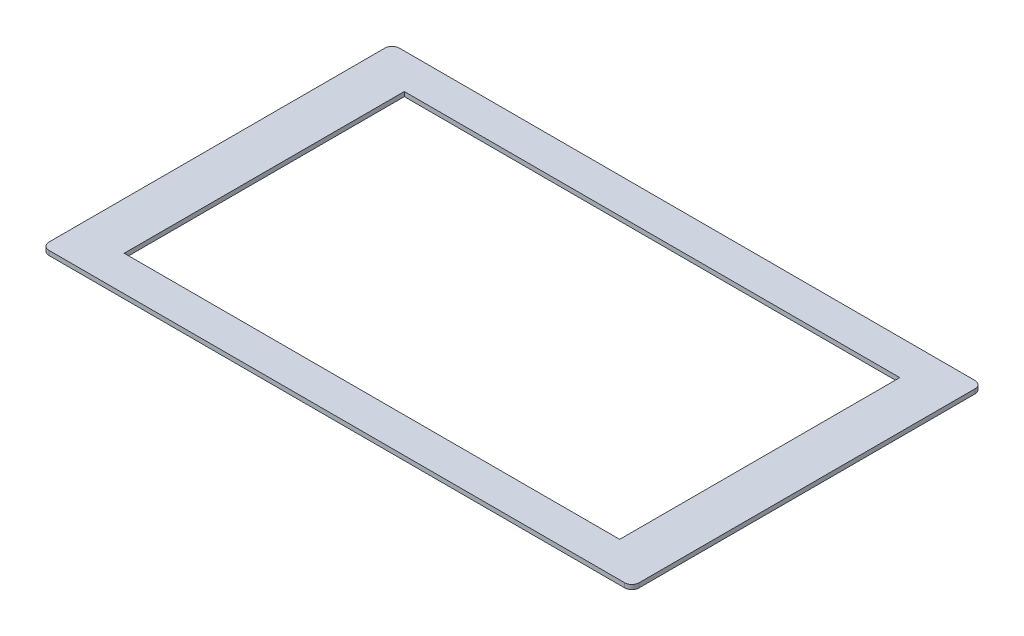
ISO-10303-21;
HEADER;
FILE_DESCRIPTION(('STEP AP214'),'2;1');
FILE_NAME('part.step','',(''),(''),'','','');
FILE_SCHEMA(('AUTOMOTIVE_DESIGN { 1 0 10303 214 1 1 1 1 }'));
ENDSEC;
DATA;
#1=APPLICATION_CONTEXT('core data for automotive mechanical design processes');
#2=APPLICATION_PROTOCOL_DEFINITION('international standard','automotive_design',2000,#1);
#3=PRODUCT_CONTEXT('',#1,'mechanical');
#4=PRODUCT('Part','Part','',(#3));
#5=PRODUCT_RELATED_PRODUCT_CATEGORY('part','',(#4));
#6=PRODUCT_DEFINITION_FORMATION('','',#4);
#7=PRODUCT_DEFINITION_CONTEXT('part definition',#1,'design');
#8=PRODUCT_DEFINITION('design','',#6,#7);
#9=PRODUCT_DEFINITION_SHAPE('','',#8);
#10=(LENGTH_UNIT() NAMED_UNIT(*) SI_UNIT(.MILLI.,.METRE.));
#11=(NAMED_UNIT(*) PLANE_ANGLE_UNIT() SI_UNIT($,.RADIAN.));
#12=(NAMED_UNIT(*) SI_UNIT($,.STERADIAN.) SOLID_ANGLE_UNIT());
#13=UNCERTAINTY_MEASURE_WITH_UNIT(LENGTH_MEASURE(1.E-05),#10,'distance_accuracy_value','');
#14=(GEOMETRIC_REPRESENTATION_CONTEXT(3) GLOBAL_UNCERTAINTY_ASSIGNED_CONTEXT((#13)) GLOBAL_UNIT_ASSIGNED_CONTEXT((#10,
#11,#12)) REPRESENTATION_CONTEXT('',''));
#15=CARTESIAN_POINT('',(0.,0.,0.));
#16=DIRECTION('',(0.,0.,1.));
#17=DIRECTION('',(1.,0.,0.));
#18=AXIS2_PLACEMENT_3D('',#15,#16,#17);
#19=CARTESIAN_POINT('',(-70.7372,0.000128867099995489,-43.045));
#20=DIRECTION('',(0.,0.,-1.));
#21=DIRECTION('',(0.,-1.,0.));
#22=AXIS2_PLACEMENT_3D('',#19,#20,#21);
#23=PLANE('',#22);
#24=DIRECTION('',(1.,0.,0.));
#25=VECTOR('',#24,1.);
#26=CARTESIAN_POINT('',(-70.7372,0.000128867099995489,-43.045));
#27=LINE('',#26,#25);
#28=CARTESIAN_POINT('',(-70.7372,0.000128867099995489,-43.045));
#29=VERTEX_POINT('',#28);
#30=CARTESIAN_POINT('',(70.737,0.000128867099995489,-43.045));
#31=VERTEX_POINT('',#30);
#32=EDGE_CURVE('E122',#29,#31,#27,.T.);
#33=ORIENTED_EDGE('',*,*,#32,.T.);
#34=DIRECTION('',(0.,-1.,0.));
#35=VECTOR('',#34,1.);
#36=CARTESIAN_POINT('',(70.737,0.000128867099995489,-43.045));
#37=LINE('',#36,#35);
#38=CARTESIAN_POINT('',(70.737,-1.0998711329,-43.045));
#39=VERTEX_POINT('',#38);
#40=EDGE_CURVE('E159',#31,#39,#37,.T.);
#41=ORIENTED_EDGE('',*,*,#40,.T.);
#42=DIRECTION('',(1.,0.,0.));
#43=VECTOR('',#42,1.);
#44=CARTESIAN_POINT('',(-70.7372,-1.0998711329,-43.045));
#45=LINE('',#44,#43);
#46=CARTESIAN_POINT('',(-70.7372,-1.0998711329,-43.045));
#47=VERTEX_POINT('',#46);
#48=EDGE_CURVE('E125',#47,#39,#45,.T.);
#49=ORIENTED_EDGE('',*,*,#48,.F.);
#50=DIRECTION('',(0.,-1.,0.));
#51=VECTOR('',#50,1.);
#52=CARTESIAN_POINT('',(-70.7372,0.000128867099995489,-43.045));
#53=LINE('',#52,#51);
#54=EDGE_CURVE('E11',#29,#47,#53,.T.);
#55=ORIENTED_EDGE('',*,*,#54,.F.);
#56=EDGE_LOOP('',(#33,#41,#49,#55));
#57=FACE_BOUND('',#56,.T.);
#58=ADVANCED_FACE('F16',(#57),#23,.T.);
#59=CARTESIAN_POINT('',(-70.7369999886866,0.000128867099995489,-41.277));
#60=DIRECTION('',(0.,-1.,0.));
#61=DIRECTION('',(-1.,0.,0.));
#62=AXIS2_PLACEMENT_3D('',#59,#60,#61);
#63=CYLINDRICAL_SURFACE('',#62,1.76800001131349);
#64=CARTESIAN_POINT('',(-70.7369999886866,0.000128867099995489,-41.277));
#65=DIRECTION('',(0.,-1.,0.));
#66=DIRECTION('',(-1.,0.,0.));
#67=AXIS2_PLACEMENT_3D('',#64,#65,#66);
#68=CIRCLE('',#67,1.76800001131349);
#69=CARTESIAN_POINT('',(-72.505,0.000128867099995489,-41.277));
#70=VERTEX_POINT('',#69);
#71=EDGE_CURVE('E128',#70,#29,#68,.T.);
#72=ORIENTED_EDGE('',*,*,#71,.T.);
#73=ORIENTED_EDGE('',*,*,#54,.T.);
#74=CARTESIAN_POINT('',(-70.7369999886866,-1.0998711329,-41.277));
#75=DIRECTION('',(0.,-1.,0.));
#76=DIRECTION('',(-1.,0.,0.));
#77=AXIS2_PLACEMENT_3D('',#74,#75,#76);
#78=CIRCLE('',#77,1.76800001131349);
#79=CARTESIAN_POINT('',(-72.505,-1.0998711329,-41.277));
#80=VERTEX_POINT('',#79);
#81=EDGE_CURVE('E157',#80,#47,#78,.T.);
#82=ORIENTED_EDGE('',*,*,#81,.F.);
#83=DIRECTION('',(0.,-1.,0.));
#84=VECTOR('',#83,1.);
#85=CARTESIAN_POINT('',(-72.505,0.000128867099995489,-41.277));
#86=LINE('',#85,#84);
#87=EDGE_CURVE('E27',#70,#80,#86,.T.);
#88=ORIENTED_EDGE('',*,*,#87,.F.);
#89=EDGE_LOOP('',(#72,#73,#82,#88));
#90=FACE_BOUND('',#89,.T.);
#91=ADVANCED_FACE('F129',(#90),#63,.T.);
#92=CARTESIAN_POINT('',(-72.505,0.000128867100004371,41.277));
#93=DIRECTION('',(-1.,0.,0.));
#94=DIRECTION('',(0.,0.,1.));
#95=AXIS2_PLACEMENT_3D('',#92,#93,#94);
#96=PLANE('',#95);
#97=DIRECTION('',(0.,0.,1.));
#98=VECTOR('',#97,1.);
#99=CARTESIAN_POINT('',(-72.505,0.000128867099995489,-41.277));
#100=LINE('',#99,#98);
#101=CARTESIAN_POINT('',(-72.505,0.000128867100004371,41.277));
#102=VERTEX_POINT('',#101);
#103=EDGE_CURVE('E133',#70,#102,#100,.T.);
#104=ORIENTED_EDGE('',*,*,#103,.F.);
#105=ORIENTED_EDGE('',*,*,#87,.T.);
#106=DIRECTION('',(0.,0.,-1.));
#107=VECTOR('',#106,1.);
#108=CARTESIAN_POINT('',(-72.505,-1.0998711329,-41.277));
#109=LINE('',#108,#107);
#110=CARTESIAN_POINT('',(-72.505,-1.09987113289999,41.277));
#111=VERTEX_POINT('',#110);
#112=EDGE_CURVE('E153',#111,#80,#109,.T.);
#113=ORIENTED_EDGE('',*,*,#112,.F.);
#114=DIRECTION('',(0.,-1.,0.));
#115=VECTOR('',#114,1.);
#116=CARTESIAN_POINT('',(-72.505,0.000128867100004371,41.277));
#117=LINE('',#116,#115);
#118=EDGE_CURVE('E166',#102,#111,#117,.T.);
#119=ORIENTED_EDGE('',*,*,#118,.F.);
#120=EDGE_LOOP('',(#104,#105,#113,#119));
#121=FACE_BOUND('',#120,.T.);
#122=ADVANCED_FACE('F272',(#121),#96,.T.);
#123=CARTESIAN_POINT('',(-70.737,0.000128867100004371,41.277));
#124=DIRECTION('',(0.,-1.,0.));
#125=DIRECTION('',(0.,0.,1.));
#126=AXIS2_PLACEMENT_3D('',#123,#124,#125);
#127=CYLINDRICAL_SURFACE('',#126,1.768);
#128=CARTESIAN_POINT('',(-70.737,0.000128867100004371,41.277));
#129=DIRECTION('',(0.,-1.,0.));
#130=DIRECTION('',(0.,0.,1.));
#131=AXIS2_PLACEMENT_3D('',#128,#129,#130);
#132=CIRCLE('',#131,1.768);
#133=CARTESIAN_POINT('',(-70.737,0.000128867100004371,43.045));
#134=VERTEX_POINT('',#133);
#135=EDGE_CURVE('E237',#134,#102,#132,.T.);
#136=ORIENTED_EDGE('',*,*,#135,.T.);
#137=ORIENTED_EDGE('',*,*,#118,.T.);
#138=CARTESIAN_POINT('',(-70.737,-1.09987113289999,41.277));
#139=DIRECTION('',(0.,-1.,0.));
#140=DIRECTION('',(0.,0.,1.));
#141=AXIS2_PLACEMENT_3D('',#138,#139,#140);
#142=CIRCLE('',#141,1.768);
#143=CARTESIAN_POINT('',(-70.737,-1.09987113289999,43.045));
#144=VERTEX_POINT('',#143);
#145=EDGE_CURVE('E158',#144,#111,#142,.T.);
#146=ORIENTED_EDGE('',*,*,#145,.F.);
#147=DIRECTION('',(0.,-1.,0.));
#148=VECTOR('',#147,1.);
#149=CARTESIAN_POINT('',(-70.737,0.000128867100004371,43.045));
#150=LINE('',#149,#148);
#151=EDGE_CURVE('E232',#134,#144,#150,.T.);
#152=ORIENTED_EDGE('',*,*,#151,.F.);
#153=EDGE_LOOP('',(#136,#137,#146,#152));
#154=FACE_BOUND('',#153,.T.);
#155=ADVANCED_FACE('F279',(#154),#127,.T.);
#156=CARTESIAN_POINT('',(70.737,0.000128867100004371,43.045));
#157=DIRECTION('',(0.,0.,1.));
#158=DIRECTION('',(1.,0.,0.));
#159=AXIS2_PLACEMENT_3D('',#156,#157,#158);
#160=PLANE('',#159);
#161=DIRECTION('',(1.,0.,0.));
#162=VECTOR('',#161,1.);
#163=CARTESIAN_POINT('',(-72.505,0.000128867100004371,43.045));
#164=LINE('',#163,#162);
#165=CARTESIAN_POINT('',(70.737,0.000128867100004371,43.045));
#166=VERTEX_POINT('',#165);
#167=EDGE_CURVE('E203',#134,#166,#164,.T.);
#168=ORIENTED_EDGE('',*,*,#167,.F.);
#169=ORIENTED_EDGE('',*,*,#151,.T.);
#170=DIRECTION('',(-1.,0.,0.));
#171=VECTOR('',#170,1.);
#172=CARTESIAN_POINT('',(-72.505,-1.09987113289999,43.045));
#173=LINE('',#172,#171);
#174=CARTESIAN_POINT('',(70.737,-1.09987113289999,43.045));
#175=VERTEX_POINT('',#174);
#176=EDGE_CURVE('E170',#175,#144,#173,.T.);
#177=ORIENTED_EDGE('',*,*,#176,.F.);
#178=DIRECTION('',(0.,-1.,0.));
#179=VECTOR('',#178,1.);
#180=CARTESIAN_POINT('',(70.737,0.000128867100004371,43.045));
#181=LINE('',#180,#179);
#182=EDGE_CURVE('E229',#166,#175,#181,.T.);
#183=ORIENTED_EDGE('',*,*,#182,.F.);
#184=EDGE_LOOP('',(#168,#169,#177,#183));
#185=FACE_BOUND('',#184,.T.);
#186=ADVANCED_FACE('F282',(#185),#160,.T.);
#187=CARTESIAN_POINT('',(70.737,0.000128867100004371,41.277));
#188=DIRECTION('',(0.,-1.,0.));
#189=DIRECTION('',(1.,0.,0.));
#190=AXIS2_PLACEMENT_3D('',#187,#188,#189);
#191=CYLINDRICAL_SURFACE('',#190,1.768);
#192=CARTESIAN_POINT('',(70.737,0.000128867100004371,41.277));
#193=DIRECTION('',(0.,-1.,0.));
#194=DIRECTION('',(1.,0.,0.));
#195=AXIS2_PLACEMENT_3D('',#192,#193,#194);
#196=CIRCLE('',#195,1.768);
#197=CARTESIAN_POINT('',(72.505,0.000128867100004371,41.277));
#198=VERTEX_POINT('',#197);
#199=EDGE_CURVE('E194',#198,#166,#196,.T.);
#200=ORIENTED_EDGE('',*,*,#199,.T.);
#201=ORIENTED_EDGE('',*,*,#182,.T.);
#202=CARTESIAN_POINT('',(70.737,-1.09987113289999,41.277));
#203=DIRECTION('',(0.,-1.,0.));
#204=DIRECTION('',(1.,0.,0.));
#205=AXIS2_PLACEMENT_3D('',#202,#203,#204);
#206=CIRCLE('',#205,1.768);
#207=CARTESIAN_POINT('',(72.505,-1.09987113289999,41.277));
#208=VERTEX_POINT('',#207);
#209=EDGE_CURVE('E171',#208,#175,#206,.T.);
#210=ORIENTED_EDGE('',*,*,#209,.F.);
#211=DIRECTION('',(0.,-1.,0.));
#212=VECTOR('',#211,1.);
#213=CARTESIAN_POINT('',(72.505,0.000128867100004371,41.277));
#214=LINE('',#213,#212);
#215=EDGE_CURVE('E162',#198,#208,#214,.T.);
#216=ORIENTED_EDGE('',*,*,#215,.F.);
#217=EDGE_LOOP('',(#200,#201,#210,#216));
#218=FACE_BOUND('',#217,.T.);
#219=ADVANCED_FACE('F18',(#218),#191,.T.);
#220=CARTESIAN_POINT('',(72.505,0.000128867099995489,-41.277));
#221=DIRECTION('',(1.,0.,0.));
#222=DIRECTION('',(0.,0.,1.));
#223=AXIS2_PLACEMENT_3D('',#220,#221,#222);
#224=PLANE('',#223);
#225=DIRECTION('',(0.,0.,1.));
#226=VECTOR('',#225,1.);
#227=CARTESIAN_POINT('',(72.505,0.000128867099995489,-43.045));
#228=LINE('',#227,#226);
#229=CARTESIAN_POINT('',(72.505,0.000128867099995489,-41.277));
#230=VERTEX_POINT('',#229);
#231=EDGE_CURVE('E184',#230,#198,#228,.T.);
#232=ORIENTED_EDGE('',*,*,#231,.T.);
#233=ORIENTED_EDGE('',*,*,#215,.T.);
#234=DIRECTION('',(0.,0.,1.));
#235=VECTOR('',#234,1.);
#236=CARTESIAN_POINT('',(72.505,-1.0998711329,-43.045));
#237=LINE('',#236,#235);
#238=CARTESIAN_POINT('',(72.505,-1.0998711329,-41.277));
#239=VERTEX_POINT('',#238);
#240=EDGE_CURVE('E175',#239,#208,#237,.T.);
#241=ORIENTED_EDGE('',*,*,#240,.F.);
#242=DIRECTION('',(0.,-1.,0.));
#243=VECTOR('',#242,1.);
#244=CARTESIAN_POINT('',(72.505,0.000128867099995489,-41.277));
#245=LINE('',#244,#243);
#246=EDGE_CURVE('E163',#230,#239,#245,.T.);
#247=ORIENTED_EDGE('',*,*,#246,.F.);
#248=EDGE_LOOP('',(#232,#233,#241,#247));
#249=FACE_BOUND('',#248,.T.);
#250=ADVANCED_FACE('F247',(#249),#224,.T.);
#251=CARTESIAN_POINT('',(70.737,0.000128867099995489,-41.277));
#252=DIRECTION('',(0.,-1.,0.));
#253=DIRECTION('',(0.,0.,-1.));
#254=AXIS2_PLACEMENT_3D('',#251,#252,#253);
#255=CYLINDRICAL_SURFACE('',#254,1.768);
#256=CARTESIAN_POINT('',(70.737,0.000128867099995489,-41.277));
#257=DIRECTION('',(0.,-1.,0.));
#258=DIRECTION('',(0.,0.,-1.));
#259=AXIS2_PLACEMENT_3D('',#256,#257,#258);
#260=CIRCLE('',#259,1.768);
#261=EDGE_CURVE('E138',#31,#230,#260,.T.);
#262=ORIENTED_EDGE('',*,*,#261,.T.);
#263=ORIENTED_EDGE('',*,*,#246,.T.);
#264=CARTESIAN_POINT('',(70.737,-1.0998711329,-41.277));
#265=DIRECTION('',(0.,-1.,0.));
#266=DIRECTION('',(0.,0.,-1.));
#267=AXIS2_PLACEMENT_3D('',#264,#265,#266);
#268=CIRCLE('',#267,1.768);
#269=EDGE_CURVE('E181',#39,#239,#268,.T.);
#270=ORIENTED_EDGE('',*,*,#269,.F.);
#271=ORIENTED_EDGE('',*,*,#40,.F.);
#272=EDGE_LOOP('',(#262,#263,#270,#271));
#273=FACE_BOUND('',#272,.T.);
#274=ADVANCED_FACE('F254',(#273),#255,.T.);
#275=CARTESIAN_POINT('',(0.,-1.0998711329,0.));
#276=DIRECTION('',(0.,-1.,0.));
#277=DIRECTION('',(-1.,0.,0.));
#278=AXIS2_PLACEMENT_3D('',#275,#276,#277);
#279=PLANE('',#278);
#280=DIRECTION('',(0.,0.,1.));
#281=VECTOR('',#280,1.);
#282=CARTESIAN_POINT('',(-60.88,-1.0998711329,17.21));
#283=LINE('',#282,#281);
#284=CARTESIAN_POINT('',(-60.88,-1.0998711329,-34.42));
#285=VERTEX_POINT('',#284);
#286=CARTESIAN_POINT('',(-60.88,-1.09987113289999,34.42));
#287=VERTEX_POINT('',#286);
#288=EDGE_CURVE('E20',#285,#287,#283,.T.);
#289=ORIENTED_EDGE('',*,*,#288,.T.);
#290=DIRECTION('',(1.,0.,0.));
#291=VECTOR('',#290,1.);
#292=CARTESIAN_POINT('',(30.44,-1.09987113289999,34.42));
#293=LINE('',#292,#291);
#294=CARTESIAN_POINT('',(60.88,-1.09987113289999,34.42));
#295=VERTEX_POINT('',#294);
#296=EDGE_CURVE('E217',#287,#295,#293,.T.);
#297=ORIENTED_EDGE('',*,*,#296,.T.);
#298=DIRECTION('',(0.,0.,-1.));
#299=VECTOR('',#298,1.);
#300=CARTESIAN_POINT('',(60.88,-1.0998711329,-17.21));
#301=LINE('',#300,#299);
#302=CARTESIAN_POINT('',(60.88,-1.0998711329,-34.42));
#303=VERTEX_POINT('',#302);
#304=EDGE_CURVE('E179',#295,#303,#301,.T.);
#305=ORIENTED_EDGE('',*,*,#304,.T.);
#306=DIRECTION('',(-1.,0.,0.));
#307=VECTOR('',#306,1.);
#308=CARTESIAN_POINT('',(-30.44,-1.0998711329,-34.42));
#309=LINE('',#308,#307);
#310=EDGE_CURVE('E151',#303,#285,#309,.T.);
#311=ORIENTED_EDGE('',*,*,#310,.T.);
#312=EDGE_LOOP('',(#289,#297,#305,#311));
#313=FACE_BOUND('',#312,.T.);
#314=ORIENTED_EDGE('',*,*,#269,.T.);
#315=ORIENTED_EDGE('',*,*,#240,.T.);
#316=ORIENTED_EDGE('',*,*,#209,.T.);
#317=ORIENTED_EDGE('',*,*,#176,.T.);
#318=ORIENTED_EDGE('',*,*,#145,.T.);
#319=ORIENTED_EDGE('',*,*,#112,.T.);
#320=ORIENTED_EDGE('',*,*,#81,.T.);
#321=ORIENTED_EDGE('',*,*,#48,.T.);
#322=EDGE_LOOP('',(#314,#315,#316,#317,#318,#319,#320,#321));
#323=FACE_BOUND('',#322,.T.);
#324=ADVANCED_FACE('F252',(#313,#323),#279,.T.);
#325=CARTESIAN_POINT('',(0.,0.00012886709999993,0.));
#326=DIRECTION('',(0.,-1.,0.));
#327=DIRECTION('',(-1.,0.,0.));
#328=AXIS2_PLACEMENT_3D('',#325,#326,#327);
#329=PLANE('',#328);
#330=DIRECTION('',(0.,0.,-1.));
#331=VECTOR('',#330,1.);
#332=CARTESIAN_POINT('',(-60.88,0.000128867100004371,17.21));
#333=LINE('',#332,#331);
#334=CARTESIAN_POINT('',(-60.88,0.000128867100004371,34.42));
#335=VERTEX_POINT('',#334);
#336=CARTESIAN_POINT('',(-60.88,0.000128867099995489,-34.42));
#337=VERTEX_POINT('',#336);
#338=EDGE_CURVE('E206',#335,#337,#333,.T.);
#339=ORIENTED_EDGE('',*,*,#338,.T.);
#340=DIRECTION('',(1.,0.,0.));
#341=VECTOR('',#340,1.);
#342=CARTESIAN_POINT('',(-30.44,0.000128867099995489,-34.42));
#343=LINE('',#342,#341);
#344=CARTESIAN_POINT('',(60.88,0.000128867099995489,-34.42));
#345=VERTEX_POINT('',#344);
#346=EDGE_CURVE('E144',#337,#345,#343,.T.);
#347=ORIENTED_EDGE('',*,*,#346,.T.);
#348=DIRECTION('',(0.,0.,1.));
#349=VECTOR('',#348,1.);
#350=CARTESIAN_POINT('',(60.88,0.00012886709999993,-17.21));
#351=LINE('',#350,#349);
#352=CARTESIAN_POINT('',(60.88,0.000128867100004371,34.42));
#353=VERTEX_POINT('',#352);
#354=EDGE_CURVE('E152',#345,#353,#351,.T.);
#355=ORIENTED_EDGE('',*,*,#354,.T.);
#356=DIRECTION('',(-1.,0.,0.));
#357=VECTOR('',#356,1.);
#358=CARTESIAN_POINT('',(30.44,0.000128867100004371,34.42));
#359=LINE('',#358,#357);
#360=EDGE_CURVE('E180',#353,#335,#359,.T.);
#361=ORIENTED_EDGE('',*,*,#360,.T.);
#362=EDGE_LOOP('',(#339,#347,#355,#361));
#363=FACE_BOUND('',#362,.T.);
#364=ORIENTED_EDGE('',*,*,#261,.F.);
#365=ORIENTED_EDGE('',*,*,#32,.F.);
#366=ORIENTED_EDGE('',*,*,#71,.F.);
#367=ORIENTED_EDGE('',*,*,#103,.T.);
#368=ORIENTED_EDGE('',*,*,#135,.F.);
#369=ORIENTED_EDGE('',*,*,#167,.T.);
#370=ORIENTED_EDGE('',*,*,#199,.F.);
#371=ORIENTED_EDGE('',*,*,#231,.F.);
#372=EDGE_LOOP('',(#364,#365,#366,#367,#368,#369,#370,#371));
#373=FACE_BOUND('',#372,.T.);
#374=ADVANCED_FACE('F135',(#363,#373),#329,.F.);
#375=CARTESIAN_POINT('',(-60.88,0.000128867099995489,-34.42));
#376=DIRECTION('',(0.,0.,-1.));
#377=DIRECTION('',(0.,-1.,0.));
#378=AXIS2_PLACEMENT_3D('',#375,#376,#377);
#379=PLANE('',#378);
#380=ORIENTED_EDGE('',*,*,#310,.F.);
#381=DIRECTION('',(0.,-1.,0.));
#382=VECTOR('',#381,1.);
#383=CARTESIAN_POINT('',(60.88,0.000128867099995489,-34.42));
#384=LINE('',#383,#382);
#385=EDGE_CURVE('E148',#345,#303,#384,.T.);
#386=ORIENTED_EDGE('',*,*,#385,.F.);
#387=ORIENTED_EDGE('',*,*,#346,.F.);
#388=DIRECTION('',(0.,-1.,0.));
#389=VECTOR('',#388,1.);
#390=CARTESIAN_POINT('',(-60.88,0.000128867099995489,-34.42));
#391=LINE('',#390,#389);
#392=EDGE_CURVE('E209',#337,#285,#391,.T.);
#393=ORIENTED_EDGE('',*,*,#392,.T.);
#394=EDGE_LOOP('',(#380,#386,#387,#393));
#395=FACE_BOUND('',#394,.T.);
#396=ADVANCED_FACE('F262',(#395),#379,.F.);
#397=CARTESIAN_POINT('',(60.88,0.000128867099995489,-34.42));
#398=DIRECTION('',(1.,0.,0.));
#399=DIRECTION('',(0.,0.,1.));
#400=AXIS2_PLACEMENT_3D('',#397,#398,#399);
#401=PLANE('',#400);
#402=ORIENTED_EDGE('',*,*,#304,.F.);
#403=DIRECTION('',(0.,-1.,0.));
#404=VECTOR('',#403,1.);
#405=CARTESIAN_POINT('',(60.88,0.000128867100004371,34.42));
#406=LINE('',#405,#404);
#407=EDGE_CURVE('E176',#353,#295,#406,.T.);
#408=ORIENTED_EDGE('',*,*,#407,.F.);
#409=ORIENTED_EDGE('',*,*,#354,.F.);
#410=ORIENTED_EDGE('',*,*,#385,.T.);
#411=EDGE_LOOP('',(#402,#408,#409,#410));
#412=FACE_BOUND('',#411,.T.);
#413=ADVANCED_FACE('F292',(#412),#401,.F.);
#414=CARTESIAN_POINT('',(60.88,0.000128867100004371,34.42));
#415=DIRECTION('',(0.,0.,1.));
#416=DIRECTION('',(1.,0.,0.));
#417=AXIS2_PLACEMENT_3D('',#414,#415,#416);
#418=PLANE('',#417);
#419=ORIENTED_EDGE('',*,*,#296,.F.);
#420=DIRECTION('',(0.,-1.,0.));
#421=VECTOR('',#420,1.);
#422=CARTESIAN_POINT('',(-60.88,0.000128867100004371,34.42));
#423=LINE('',#422,#421);
#424=EDGE_CURVE('E208',#335,#287,#423,.T.);
#425=ORIENTED_EDGE('',*,*,#424,.F.);
#426=ORIENTED_EDGE('',*,*,#360,.F.);
#427=ORIENTED_EDGE('',*,*,#407,.T.);
#428=EDGE_LOOP('',(#419,#425,#426,#427));
#429=FACE_BOUND('',#428,.T.);
#430=ADVANCED_FACE('F288',(#429),#418,.F.);
#431=CARTESIAN_POINT('',(-60.88,0.000128867100004371,34.42));
#432=DIRECTION('',(-1.,0.,0.));
#433=DIRECTION('',(0.,0.,1.));
#434=AXIS2_PLACEMENT_3D('',#431,#432,#433);
#435=PLANE('',#434);
#436=ORIENTED_EDGE('',*,*,#288,.F.);
#437=ORIENTED_EDGE('',*,*,#392,.F.);
#438=ORIENTED_EDGE('',*,*,#338,.F.);
#439=ORIENTED_EDGE('',*,*,#424,.T.);
#440=EDGE_LOOP('',(#436,#437,#438,#439));
#441=FACE_BOUND('',#440,.T.);
#442=ADVANCED_FACE('F291',(#441),#435,.F.);
#443=CLOSED_SHELL('',(#58,#91,#122,#155,#186,#219,#250,#274,#324,#374,#396,#413,#430,#442));
#444=MANIFOLD_SOLID_BREP('B1',#443);
#445=ADVANCED_BREP_SHAPE_REPRESENTATION('',(#18,#444),#14);
#446=SHAPE_DEFINITION_REPRESENTATION(#9,#445);
ENDSEC;
END-ISO-10303-21;
